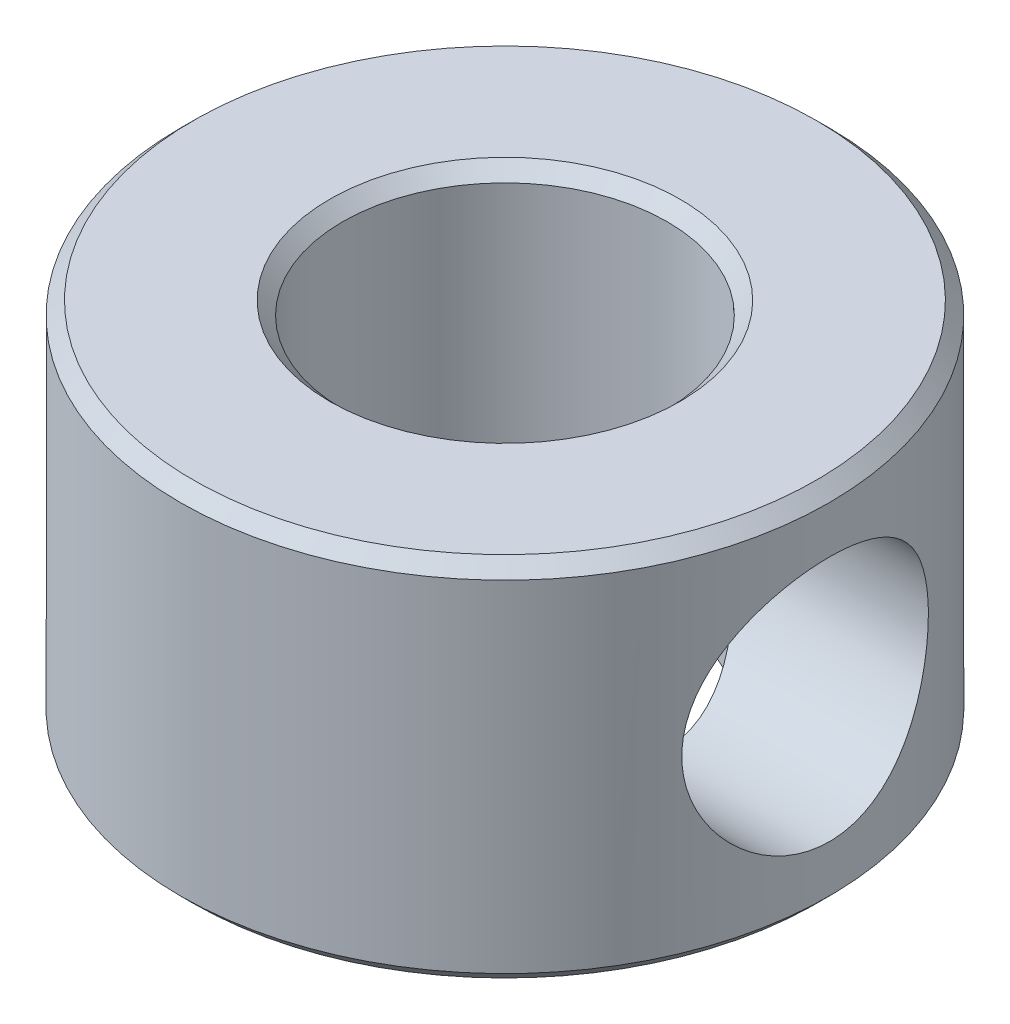
ISO-10303-21;
HEADER;
FILE_DESCRIPTION(('STEP AP214'),'2;1');
FILE_NAME('part.step','',(''),(''),'','','');
FILE_SCHEMA(('AUTOMOTIVE_DESIGN { 1 0 10303 214 1 1 1 1 }'));
ENDSEC;
DATA;
#1=APPLICATION_CONTEXT('core data for automotive mechanical design processes');
#2=APPLICATION_PROTOCOL_DEFINITION('international standard','automotive_design',2000,#1);
#3=PRODUCT_CONTEXT('',#1,'mechanical');
#4=PRODUCT('Part','Part','',(#3));
#5=PRODUCT_RELATED_PRODUCT_CATEGORY('part','',(#4));
#6=PRODUCT_DEFINITION_FORMATION('','',#4);
#7=PRODUCT_DEFINITION_CONTEXT('part definition',#1,'design');
#8=PRODUCT_DEFINITION('design','',#6,#7);
#9=PRODUCT_DEFINITION_SHAPE('','',#8);
#10=(LENGTH_UNIT() NAMED_UNIT(*) SI_UNIT(.MILLI.,.METRE.));
#11=(NAMED_UNIT(*) PLANE_ANGLE_UNIT() SI_UNIT($,.RADIAN.));
#12=(NAMED_UNIT(*) SI_UNIT($,.STERADIAN.) SOLID_ANGLE_UNIT());
#13=UNCERTAINTY_MEASURE_WITH_UNIT(LENGTH_MEASURE(1.E-05),#10,'distance_accuracy_value','');
#14=(GEOMETRIC_REPRESENTATION_CONTEXT(3) GLOBAL_UNCERTAINTY_ASSIGNED_CONTEXT((#13)) GLOBAL_UNIT_ASSIGNED_CONTEXT((#10,
#11,#12)) REPRESENTATION_CONTEXT('',''));
#15=CARTESIAN_POINT('',(0.,0.,0.));
#16=DIRECTION('',(0.,0.,1.));
#17=DIRECTION('',(1.,0.,0.));
#18=AXIS2_PLACEMENT_3D('',#15,#16,#17);
#19=CARTESIAN_POINT('',(0.,0.,0.));
#20=DIRECTION('',(0.,-1.,0.));
#21=DIRECTION('',(0.,0.,-1.));
#22=AXIS2_PLACEMENT_3D('',#19,#20,#21);
#23=CONICAL_SURFACE('',#22,3.42899999998281,0.785398163397448);
#24=CARTESIAN_POINT('',(0.,0.,0.));
#25=DIRECTION('',(0.,-1.,0.));
#26=DIRECTION('',(0.,0.,-1.));
#27=AXIS2_PLACEMENT_3D('',#24,#25,#26);
#28=CIRCLE('',#27,3.42899999998281);
#29=CARTESIAN_POINT('',(0.,0.,-3.42899999998281));
#30=VERTEX_POINT('',#29);
#31=EDGE_CURVE('E73',#30,#30,#28,.T.);
#32=ORIENTED_EDGE('',*,*,#31,.T.);
#33=EDGE_LOOP('',(#32));
#34=FACE_BOUND('',#33,.T.);
#35=CARTESIAN_POINT('',(0.,0.254,0.));
#36=DIRECTION('',(0.,1.,0.));
#37=DIRECTION('',(0.,0.,1.));
#38=AXIS2_PLACEMENT_3D('',#35,#36,#37);
#39=CIRCLE('',#38,3.175);
#40=CARTESIAN_POINT('',(0.,0.254,3.175));
#41=VERTEX_POINT('',#40);
#42=EDGE_CURVE('E36',#41,#41,#39,.T.);
#43=ORIENTED_EDGE('',*,*,#42,.T.);
#44=EDGE_LOOP('',(#43));
#45=FACE_BOUND('',#44,.T.);
#46=ADVANCED_FACE('F15',(#34,#45),#23,.F.);
#47=CARTESIAN_POINT('',(0.,7.17549999995981,0.));
#48=DIRECTION('',(0.,1.,0.));
#49=DIRECTION('',(0.,0.,1.));
#50=AXIS2_PLACEMENT_3D('',#47,#48,#49);
#51=CONICAL_SURFACE('',#50,3.42899999998281,0.785398163397448);
#52=CARTESIAN_POINT('',(0.,6.9215,0.));
#53=DIRECTION('',(0.,1.,0.));
#54=DIRECTION('',(0.,0.,1.));
#55=AXIS2_PLACEMENT_3D('',#52,#53,#54);
#56=CIRCLE('',#55,3.175);
#57=CARTESIAN_POINT('',(0.,6.9215,3.175));
#58=VERTEX_POINT('',#57);
#59=EDGE_CURVE('E65',#58,#58,#56,.F.);
#60=ORIENTED_EDGE('',*,*,#59,.T.);
#61=EDGE_LOOP('',(#60));
#62=FACE_BOUND('',#61,.T.);
#63=CARTESIAN_POINT('',(0.,7.17549999995981,0.));
#64=DIRECTION('',(0.,1.,0.));
#65=DIRECTION('',(0.,0.,1.));
#66=AXIS2_PLACEMENT_3D('',#63,#64,#65);
#67=CIRCLE('',#66,3.42899999998281);
#68=CARTESIAN_POINT('',(0.,7.17549999995981,3.42899999998281));
#69=VERTEX_POINT('',#68);
#70=EDGE_CURVE('E18',#69,#69,#67,.F.);
#71=ORIENTED_EDGE('',*,*,#70,.F.);
#72=EDGE_LOOP('',(#71));
#73=FACE_BOUND('',#72,.T.);
#74=ADVANCED_FACE('F97',(#62,#73),#51,.F.);
#75=CARTESIAN_POINT('',(0.,7.1755,0.));
#76=DIRECTION('',(0.,1.,0.));
#77=DIRECTION('',(0.,0.,1.));
#78=AXIS2_PLACEMENT_3D('',#75,#76,#77);
#79=PLANE('',#78);
#80=ORIENTED_EDGE('',*,*,#70,.T.);
#81=EDGE_LOOP('',(#80));
#82=FACE_BOUND('',#81,.T.);
#83=CARTESIAN_POINT('',(0.,7.17550000001665,0.));
#84=DIRECTION('',(0.,-1.,0.));
#85=DIRECTION('',(0.,0.,-1.));
#86=AXIS2_PLACEMENT_3D('',#83,#84,#85);
#87=CIRCLE('',#86,6.09600000001365);
#88=CARTESIAN_POINT('',(0.,7.17550000001665,-6.09600000001365));
#89=VERTEX_POINT('',#88);
#90=EDGE_CURVE('E67',#89,#89,#87,.T.);
#91=ORIENTED_EDGE('',*,*,#90,.F.);
#92=EDGE_LOOP('',(#91));
#93=FACE_BOUND('',#92,.T.);
#94=ADVANCED_FACE('F88',(#82,#93),#79,.T.);
#95=CARTESIAN_POINT('',(0.,0.,0.));
#96=DIRECTION('',(0.,1.,0.));
#97=DIRECTION('',(0.,0.,1.));
#98=AXIS2_PLACEMENT_3D('',#95,#96,#97);
#99=PLANE('',#98);
#100=ORIENTED_EDGE('',*,*,#31,.F.);
#101=EDGE_LOOP('',(#100));
#102=FACE_BOUND('',#101,.T.);
#103=CARTESIAN_POINT('',(0.,5.6843418860808E-11,0.));
#104=DIRECTION('',(0.,1.,0.));
#105=DIRECTION('',(0.,0.,1.));
#106=AXIS2_PLACEMENT_3D('',#103,#104,#105);
#107=CIRCLE('',#106,6.0959999999568);
#108=CARTESIAN_POINT('',(0.,5.6843418860808E-11,6.0959999999568));
#109=VERTEX_POINT('',#108);
#110=EDGE_CURVE('E64',#109,#109,#107,.T.);
#111=ORIENTED_EDGE('',*,*,#110,.F.);
#112=EDGE_LOOP('',(#111));
#113=FACE_BOUND('',#112,.T.);
#114=ADVANCED_FACE('F85',(#102,#113),#99,.F.);
#115=CARTESIAN_POINT('',(0.,0.,0.));
#116=DIRECTION('',(0.,1.,0.));
#117=DIRECTION('',(0.,0.,1.));
#118=AXIS2_PLACEMENT_3D('',#115,#116,#117);
#119=CYLINDRICAL_SURFACE('',#118,3.175);
#120=ORIENTED_EDGE('',*,*,#42,.F.);
#121=EDGE_LOOP('',(#120));
#122=FACE_BOUND('',#121,.T.);
#123=CARTESIAN_POINT('',(2.06350575477753,3.58775,-2.413));
#124=CARTESIAN_POINT('',(2.06350331734548,3.64373102336542,-2.41300116636526));
#125=CARTESIAN_POINT('',(2.065797453746,3.69970091216051,-2.4110462158827));
#126=CARTESIAN_POINT('',(2.07480651484921,3.81102619733832,-2.40329681190075));
#127=CARTESIAN_POINT('',(2.08152327534689,3.8663813288335,-2.39750076398684));
#128=CARTESIAN_POINT('',(2.10779575765198,4.03096671508492,-2.37452857368797));
#129=CARTESIAN_POINT('',(2.13347116105826,4.13848577646196,-2.35176933884989));
#130=CARTESIAN_POINT('',(2.20269021569742,4.36763246714568,-2.28722418083166));
#131=CARTESIAN_POINT('',(2.24883104097927,4.48757930738447,-2.24247678468505));
#132=CARTESIAN_POINT('',(2.34961279035049,4.71608776414318,-2.1366571908072));
#133=CARTESIAN_POINT('',(2.40426496806902,4.82463398406284,-2.07556330198389));
#134=CARTESIAN_POINT('',(2.51753996525444,5.03264587802023,-1.93671051886915));
#135=CARTESIAN_POINT('',(2.57622631801355,5.13183406250293,-1.85858971197057));
#136=CARTESIAN_POINT('',(2.69156511170815,5.31741036611413,-1.68723508065523));
#137=CARTESIAN_POINT('',(2.74821927046582,5.40380949876266,-1.5940144063819));
#138=CARTESIAN_POINT('',(2.85315193887402,5.55892467615017,-1.39716635485653));
#139=CARTESIAN_POINT('',(2.90168287826838,5.62823270651883,-1.2941434877332));
#140=CARTESIAN_POINT('',(2.98960931443145,5.75144375167086,-1.07549284146984));
#141=CARTESIAN_POINT('',(3.02900667042063,5.80534990216122,-0.959867634703158));
#142=CARTESIAN_POINT('',(3.07878886870738,5.87272481794675,-0.778268780759372));
#143=CARTESIAN_POINT('',(3.09388433020333,5.89300530870763,-0.71603074775631));
#144=CARTESIAN_POINT('',(3.12047967112838,5.92857862714859,-0.589411732485593));
#145=CARTESIAN_POINT('',(3.13198152553263,5.94387419464357,-0.525031948885168));
#146=CARTESIAN_POINT('',(3.15105644572041,5.96917180911156,-0.39471468955541));
#147=CARTESIAN_POINT('',(3.15863253681296,5.97917793240652,-0.328778454368978));
#148=CARTESIAN_POINT('',(3.16964685297938,5.99370635862612,-0.195988123621079));
#149=CARTESIAN_POINT('',(3.17308583147031,5.99822966003851,-0.129134197425563));
#150=CARTESIAN_POINT('',(3.17660104788137,6.00285936131939,0.0511839734686778));
#151=CARTESIAN_POINT('',(3.17271039078429,5.99775232164968,0.164927729705171));
#152=CARTESIAN_POINT('',(3.15304239444254,5.97179860624595,0.389465364093218));
#153=CARTESIAN_POINT('',(3.13726479729506,5.95095158901236,0.500259178187893));
#154=CARTESIAN_POINT('',(3.09583776822383,5.89566648140617,0.712565518725814));
#155=CARTESIAN_POINT('',(3.07051350908311,5.86167521274124,0.81426016244009));
#156=CARTESIAN_POINT('',(3.01173481606194,5.78165655320256,1.01022752362915));
#157=CARTESIAN_POINT('',(2.97827904498174,5.73562718260874,1.10449901701257));
#158=CARTESIAN_POINT('',(2.90036237107335,5.62630630707544,1.29638388211799));
#159=CARTESIAN_POINT('',(2.85503193439217,5.56153871019377,1.39279787549681));
#160=CARTESIAN_POINT('',(2.7593154286224,5.42036015415664,1.57395181675997));
#161=CARTESIAN_POINT('',(2.70892331802777,5.34393522328477,1.65867752061776));
#162=CARTESIAN_POINT('',(2.59554790264758,5.1640374459975,1.83208839918216));
#163=CARTESIAN_POINT('',(2.53209523862624,5.05822843122925,1.91804720150165));
#164=CARTESIAN_POINT('',(2.4080110589705,4.83249277772522,2.07167080696696));
#165=CARTESIAN_POINT('',(2.34737881309176,4.7125698219863,2.13934036751724));
#166=CARTESIAN_POINT('',(2.25298451550365,4.49572297827659,2.23783654656671));
#167=CARTESIAN_POINT('',(2.21653438652381,4.40224345755611,2.2736551086894));
#168=CARTESIAN_POINT('',(2.15299951018114,4.20873654797274,2.33391186939965));
#169=CARTESIAN_POINT('',(2.12588916683273,4.10872796273694,2.35838123568328));
#170=CARTESIAN_POINT('',(2.09195623579652,3.93804252759953,2.38844545558512));
#171=CARTESIAN_POINT('',(2.08138138390222,3.86873364027225,2.39761524399995));
#172=CARTESIAN_POINT('',(2.06715899430662,3.72886028316942,2.40989063003403));
#173=CARTESIAN_POINT('',(2.06350882638652,3.6582963004036,2.41299853016703));
#174=CARTESIAN_POINT('',(2.06350331734548,3.53176897663458,2.41300116636526));
#175=CARTESIAN_POINT('',(2.065797453746,3.47579908783949,2.4110462158827));
#176=CARTESIAN_POINT('',(2.07480651484921,3.36447380266168,2.40329681190075));
#177=CARTESIAN_POINT('',(2.08152327534689,3.3091186711665,2.39750076398684));
#178=CARTESIAN_POINT('',(2.10779575765197,3.14453328491508,2.37452857368797));
#179=CARTESIAN_POINT('',(2.13347116105826,3.03701422353804,2.35176933884989));
#180=CARTESIAN_POINT('',(2.20269021569742,2.80786753285432,2.28722418083166));
#181=CARTESIAN_POINT('',(2.24883104097927,2.68792069261554,2.24247678468506));
#182=CARTESIAN_POINT('',(2.34961279035049,2.45941223585682,2.1366571908072));
#183=CARTESIAN_POINT('',(2.40426496806902,2.35086601593716,2.07556330198389));
#184=CARTESIAN_POINT('',(2.51753996525444,2.14285412197977,1.93671051886915));
#185=CARTESIAN_POINT('',(2.57622631801355,2.04366593749707,1.85858971197057));
#186=CARTESIAN_POINT('',(2.69156511170815,1.85808963388587,1.68723508065523));
#187=CARTESIAN_POINT('',(2.74821927046581,1.77169050123733,1.5940144063819));
#188=CARTESIAN_POINT('',(2.85315193887402,1.61657532384983,1.39716635485653));
#189=CARTESIAN_POINT('',(2.90168287826838,1.54726729348117,1.2941434877332));
#190=CARTESIAN_POINT('',(2.98960931443145,1.42405624832914,1.07549284146984));
#191=CARTESIAN_POINT('',(3.02900667042063,1.37015009783878,0.95986763470316));
#192=CARTESIAN_POINT('',(3.07878886870738,1.30277518205325,0.778268780759374));
#193=CARTESIAN_POINT('',(3.09388433020333,1.28249469129237,0.716030747756312));
#194=CARTESIAN_POINT('',(3.12047967112838,1.24692137285141,0.589411732485594));
#195=CARTESIAN_POINT('',(3.13198152553263,1.23162580535643,0.52503194888517));
#196=CARTESIAN_POINT('',(3.15105644572041,1.20632819088844,0.394714689555412));
#197=CARTESIAN_POINT('',(3.15863253681296,1.19632206759347,0.32877845436898));
#198=CARTESIAN_POINT('',(3.16964685297938,1.18179364137388,0.195988123621081));
#199=CARTESIAN_POINT('',(3.17308583147031,1.17727033996149,0.129134197425564));
#200=CARTESIAN_POINT('',(3.17660104788137,1.17264063868061,-0.0511839734686767));
#201=CARTESIAN_POINT('',(3.17271039078429,1.17774767835032,-0.164927729705169));
#202=CARTESIAN_POINT('',(3.15304239444254,1.20370139375405,-0.389465364093217));
#203=CARTESIAN_POINT('',(3.13726479729506,1.22454841098764,-0.500259178187892));
#204=CARTESIAN_POINT('',(3.09583776822383,1.27983351859383,-0.712565518725814));
#205=CARTESIAN_POINT('',(3.07051350908311,1.31382478725876,-0.81426016244009));
#206=CARTESIAN_POINT('',(3.01173481606194,1.39384344679744,-1.01022752362915));
#207=CARTESIAN_POINT('',(2.97827904498174,1.43987281739125,-1.10449901701257));
#208=CARTESIAN_POINT('',(2.90036237107335,1.54919369292456,-1.29638388211799));
#209=CARTESIAN_POINT('',(2.85503193439217,1.61396128980622,-1.39279787549681));
#210=CARTESIAN_POINT('',(2.7593154286224,1.75513984584336,-1.57395181675996));
#211=CARTESIAN_POINT('',(2.70892331802777,1.83156477671523,-1.65867752061776));
#212=CARTESIAN_POINT('',(2.59554790264758,2.0114625540025,-1.83208839918216));
#213=CARTESIAN_POINT('',(2.53209523862624,2.11727156877075,-1.91804720150165));
#214=CARTESIAN_POINT('',(2.4080110589705,2.34300722227478,-2.07167080696696));
#215=CARTESIAN_POINT('',(2.34737881309176,2.46293017801369,-2.13934036751724));
#216=CARTESIAN_POINT('',(2.25298451550366,2.67977702172341,-2.23783654656671));
#217=CARTESIAN_POINT('',(2.21653438652381,2.77325654244388,-2.2736551086894));
#218=CARTESIAN_POINT('',(2.15299951018114,2.96676345202726,-2.33391186939965));
#219=CARTESIAN_POINT('',(2.12588916683273,3.06677203726306,-2.35838123568328));
#220=CARTESIAN_POINT('',(2.09195623579653,3.23745747240046,-2.38844545558512));
#221=CARTESIAN_POINT('',(2.08138138390222,3.30676635972774,-2.39761524399995));
#222=CARTESIAN_POINT('',(2.06715899430662,3.44663971683058,-2.40989063003403));
#223=CARTESIAN_POINT('',(2.06350882638652,3.5172036995964,-2.41299853016703));
#224=CARTESIAN_POINT('',(2.06350575477753,3.58775,-2.413));
#225=B_SPLINE_CURVE_WITH_KNOTS('',3,(#123,#124,#125,#126,#127,#128,#129,#130,#131,#132,#133,
#134,#135,#136,#137,#138,#139,#140,#141,#142,#143,#144,#145,#146,#147,#148,#149,#150,#151,#152,
#153,#154,#155,#156,#157,#158,#159,#160,#161,#162,#163,#164,#165,#166,#167,#168,#169,#170,#171,
#172,#173,#174,#175,#176,#177,#178,#179,#180,#181,#182,#183,#184,#185,#186,#187,#188,#189,#190,
#191,#192,#193,#194,#195,#196,#197,#198,#199,#200,#201,#202,#203,#204,#205,#206,#207,#208,#209,
#210,#211,#212,#213,#214,#215,#216,#217,#218,#219,#220,#221,#222,#223,#224),.UNSPECIFIED.,.T.,
.F.,(4,2,2,2,2,2,2,2,2,2,2,2,2,2,2,2,2,2,2,2,2,2,2,2,2,2,2,2,2,2,2,2,2,2,2,2,2,2,2,2,2,2,2,2,2,
2,2,2,2,2,4),(0.,0.167840899061439,0.335751511461487,0.672253052316326,1.07834593721034,
1.48498038555627,1.90128952676945,2.317238043711,2.71564864583153,3.11397807665489,
3.31524468155856,3.51640047896582,3.71740102837412,3.91836496766418,4.25822456424176,
4.59809153473323,4.92729791228549,5.25655846338996,5.62924960414818,6.00239098979998,
6.45175261568918,6.90099724071932,7.21968561176668,7.53749352673918,7.74908405883766,
7.96059420590855,8.12843510496999,8.29634571737004,8.63284725822488,9.03894014311888,
9.44557459146482,9.861883732678,10.2778322496195,10.6762428517401,11.0745722825634,
11.2758388874671,11.4769946848744,11.6779952342827,11.8789591735727,12.2188187701503,
12.5586857406418,12.887892118194,13.2171526692985,13.5898438100567,13.9629851957085,
14.4123468215977,14.8615914466279,15.1802798176752,15.4980877326477,15.7096782647462,
15.9211884118171),.UNSPECIFIED.);
#226=CARTESIAN_POINT('',(2.06350575477753,3.58775,-2.413));
#227=VERTEX_POINT('',#226);
#228=EDGE_CURVE('E38',#227,#227,#225,.T.);
#229=ORIENTED_EDGE('',*,*,#228,.T.);
#230=EDGE_LOOP('',(#229));
#231=FACE_BOUND('',#230,.T.);
#232=ORIENTED_EDGE('',*,*,#59,.F.);
#233=EDGE_LOOP('',(#232));
#234=FACE_BOUND('',#233,.T.);
#235=ADVANCED_FACE('F87',(#122,#231,#234),#119,.F.);
#236=CARTESIAN_POINT('',(0.,6.92149999991898,0.));
#237=DIRECTION('',(0.,-1.,0.));
#238=DIRECTION('',(0.,0.,-1.));
#239=AXIS2_PLACEMENT_3D('',#236,#237,#238);
#240=CONICAL_SURFACE('',#239,6.35000000011132,0.785398163397448);
#241=CARTESIAN_POINT('',(0.,6.9215,0.));
#242=DIRECTION('',(0.,1.,0.));
#243=DIRECTION('',(0.,0.,1.));
#244=AXIS2_PLACEMENT_3D('',#241,#242,#243);
#245=CIRCLE('',#244,6.35);
#246=CARTESIAN_POINT('',(0.,6.9215,6.35));
#247=VERTEX_POINT('',#246);
#248=EDGE_CURVE('E27',#247,#247,#245,.F.);
#249=ORIENTED_EDGE('',*,*,#248,.F.);
#250=EDGE_LOOP('',(#249));
#251=FACE_BOUND('',#250,.T.);
#252=ORIENTED_EDGE('',*,*,#90,.T.);
#253=EDGE_LOOP('',(#252));
#254=FACE_BOUND('',#253,.T.);
#255=ADVANCED_FACE('F95',(#251,#254),#240,.T.);
#256=CARTESIAN_POINT('',(0.,0.254000000040833,0.));
#257=DIRECTION('',(0.,1.,0.));
#258=DIRECTION('',(0.,0.,1.));
#259=AXIS2_PLACEMENT_3D('',#256,#257,#258);
#260=CONICAL_SURFACE('',#259,6.34999999994079,0.785398163397448);
#261=ORIENTED_EDGE('',*,*,#110,.T.);
#262=EDGE_LOOP('',(#261));
#263=FACE_BOUND('',#262,.T.);
#264=CARTESIAN_POINT('',(0.,0.254,0.));
#265=DIRECTION('',(0.,1.,0.));
#266=DIRECTION('',(0.,0.,1.));
#267=AXIS2_PLACEMENT_3D('',#264,#265,#266);
#268=CIRCLE('',#267,6.35);
#269=CARTESIAN_POINT('',(0.,0.254,6.35));
#270=VERTEX_POINT('',#269);
#271=EDGE_CURVE('E22',#270,#270,#268,.T.);
#272=ORIENTED_EDGE('',*,*,#271,.F.);
#273=EDGE_LOOP('',(#272));
#274=FACE_BOUND('',#273,.T.);
#275=ADVANCED_FACE('F55',(#263,#274),#260,.T.);
#276=CARTESIAN_POINT('',(0.,3.58775,0.));
#277=DIRECTION('',(1.,0.,0.));
#278=DIRECTION('',(0.,0.,-1.));
#279=AXIS2_PLACEMENT_3D('',#276,#277,#278);
#280=CYLINDRICAL_SURFACE('',#279,2.413);
#281=CARTESIAN_POINT('',(5.87366418856237,3.58775,-2.413));
#282=CARTESIAN_POINT('',(5.87367180957185,3.45777727241982,-2.41299211036134));
#283=CARTESIAN_POINT('',(5.87803446078459,3.32768224391578,-2.40244573695549));
#284=CARTESIAN_POINT('',(5.89493112529326,3.0712902804737,-2.36067101815251));
#285=CARTESIAN_POINT('',(5.90747799394448,2.94499964833227,-2.32941013422183));
#286=CARTESIAN_POINT('',(5.93910592053698,2.70019760640208,-2.24753750310633));
#287=CARTESIAN_POINT('',(5.95816658425535,2.58166327599099,-2.19698609621875));
#288=CARTESIAN_POINT('',(6.0006468163521,2.35475344210928,-2.07814922993327));
#289=CARTESIAN_POINT('',(6.02406641060781,2.2463779989539,-2.00986366525335));
#290=CARTESIAN_POINT('',(6.07397227259065,2.03726473650657,-1.85374508747788));
#291=CARTESIAN_POINT('',(6.10055057204308,1.93711780920942,-1.76514972086256));
#292=CARTESIAN_POINT('',(6.15301332433472,1.7526822366681,-1.57253987413986));
#293=CARTESIAN_POINT('',(6.17889759379266,1.66839774797521,-1.46852136532378));
#294=CARTESIAN_POINT('',(6.22814881621845,1.515225046788,-1.24352834107207));
#295=CARTESIAN_POINT('',(6.25139572601309,1.44698007817193,-1.12208727707208));
#296=CARTESIAN_POINT('',(6.29164729718719,1.33213455795031,-0.868408074733262));
#297=CARTESIAN_POINT('',(6.30865418755839,1.28552627594244,-0.736173812497092));
#298=CARTESIAN_POINT('',(6.33385765303732,1.21735309382466,-0.470860050155738));
#299=CARTESIAN_POINT('',(6.34241022734481,1.19477288008998,-0.33807591949005));
#300=CARTESIAN_POINT('',(6.35102080969203,1.17204045034324,-0.0703460721620404));
#301=CARTESIAN_POINT('',(6.35108166089634,1.17188072759247,0.0645989058796114));
#302=CARTESIAN_POINT('',(6.34292648343432,1.19340926481606,0.325530367770508));
#303=CARTESIAN_POINT('',(6.33513060699424,1.21398847186378,0.451623788433641));
#304=CARTESIAN_POINT('',(6.31269194543665,1.27454115101691,0.698413030431242));
#305=CARTESIAN_POINT('',(6.29804865551838,1.31451605300785,0.819108453098982));
#306=CARTESIAN_POINT('',(6.26309295494474,1.41322554549681,1.05378365107773));
#307=CARTESIAN_POINT('',(6.24270038417629,1.4722272259887,1.16763864820871));
#308=CARTESIAN_POINT('',(6.19830310699296,1.60707406541514,1.38411215195717));
#309=CARTESIAN_POINT('',(6.17429737293314,1.68292401921408,1.48672744742082));
#310=CARTESIAN_POINT('',(6.12344532073828,1.85461319829079,1.68432291064807));
#311=CARTESIAN_POINT('',(6.0965149808738,1.95137644331052,1.77847971681606));
#312=CARTESIAN_POINT('',(6.04397973738038,2.15950482776329,1.94957447410654));
#313=CARTESIAN_POINT('',(6.01837558691908,2.2708781404047,2.02650272147514));
#314=CARTESIAN_POINT('',(5.97084581879832,2.50843470458754,2.16259905806743));
#315=CARTESIAN_POINT('',(5.94902315130444,2.6349090842737,2.22129695396536));
#316=CARTESIAN_POINT('',(5.91274440511587,2.89687376909544,2.31615500109406));
#317=CARTESIAN_POINT('',(5.89827253384981,3.03234403269003,2.35236350653789));
#318=CARTESIAN_POINT('',(5.8836088611195,3.23892151238498,2.38867989045813));
#319=CARTESIAN_POINT('',(5.87989508578566,3.30830928066115,2.39778589744487));
#320=CARTESIAN_POINT('',(5.87492069784399,3.44770286095434,2.40994807363667));
#321=CARTESIAN_POINT('',(5.87366008165752,3.51770867206962,2.41300425166709));
#322=CARTESIAN_POINT('',(5.87367180957185,3.71772272758018,2.41299211036134));
#323=CARTESIAN_POINT('',(5.87803446078459,3.84781775608422,2.40244573695549));
#324=CARTESIAN_POINT('',(5.89493112529326,4.1042097195263,2.36067101815251));
#325=CARTESIAN_POINT('',(5.90747799394448,4.23050035166773,2.32941013422183));
#326=CARTESIAN_POINT('',(5.93910592053698,4.47530239359792,2.24753750310633));
#327=CARTESIAN_POINT('',(5.95816658425535,4.59383672400901,2.19698609621875));
#328=CARTESIAN_POINT('',(6.0006468163521,4.82074655789072,2.07814922993327));
#329=CARTESIAN_POINT('',(6.02406641060781,4.9291220010461,2.00986366525335));
#330=CARTESIAN_POINT('',(6.07397227259065,5.13823526349343,1.85374508747788));
#331=CARTESIAN_POINT('',(6.10055057204308,5.23838219079058,1.76514972086256));
#332=CARTESIAN_POINT('',(6.15301332433472,5.4228177633319,1.57253987413986));
#333=CARTESIAN_POINT('',(6.17889759379266,5.50710225202479,1.46852136532378));
#334=CARTESIAN_POINT('',(6.22814881621845,5.660274953212,1.24352834107207));
#335=CARTESIAN_POINT('',(6.25139572601309,5.72851992182807,1.12208727707208));
#336=CARTESIAN_POINT('',(6.29164729718719,5.84336544204969,0.868408074733262));
#337=CARTESIAN_POINT('',(6.30865418755839,5.88997372405756,0.736173812497091));
#338=CARTESIAN_POINT('',(6.33385765303732,5.95814690617534,0.470860050155738));
#339=CARTESIAN_POINT('',(6.34241022734481,5.98072711991002,0.33807591949005));
#340=CARTESIAN_POINT('',(6.35102080969203,6.00345954965675,0.0703460721620408));
#341=CARTESIAN_POINT('',(6.35108166089634,6.00361927240753,-0.0645989058796113));
#342=CARTESIAN_POINT('',(6.34292648343432,5.98209073518394,-0.325530367770508));
#343=CARTESIAN_POINT('',(6.33513060699424,5.96151152813622,-0.451623788433642));
#344=CARTESIAN_POINT('',(6.31269194543665,5.90095884898309,-0.698413030431243));
#345=CARTESIAN_POINT('',(6.29804865551838,5.86098394699215,-0.819108453098982));
#346=CARTESIAN_POINT('',(6.26309295494474,5.76227445450319,-1.05378365107773));
#347=CARTESIAN_POINT('',(6.24270038417628,5.7032727740113,-1.16763864820872));
#348=CARTESIAN_POINT('',(6.19830310699295,5.56842593458486,-1.38411215195717));
#349=CARTESIAN_POINT('',(6.17429737293314,5.49257598078591,-1.48672744742082));
#350=CARTESIAN_POINT('',(6.12344532073828,5.32088680170921,-1.68432291064808));
#351=CARTESIAN_POINT('',(6.0965149808738,5.22412355668948,-1.77847971681606));
#352=CARTESIAN_POINT('',(6.04397973738038,5.01599517223671,-1.94957447410654));
#353=CARTESIAN_POINT('',(6.01837558691908,4.9046218595953,-2.02650272147514));
#354=CARTESIAN_POINT('',(5.97084581879832,4.66706529541245,-2.16259905806743));
#355=CARTESIAN_POINT('',(5.94902315130444,4.5405909157263,-2.22129695396536));
#356=CARTESIAN_POINT('',(5.91274440511587,4.27862623090456,-2.31615500109406));
#357=CARTESIAN_POINT('',(5.89827253384981,4.14315596730997,-2.35236350653789));
#358=CARTESIAN_POINT('',(5.8836088611195,3.93657848761502,-2.38867989045813));
#359=CARTESIAN_POINT('',(5.87989508578566,3.86719071933885,-2.39778589744487));
#360=CARTESIAN_POINT('',(5.87492069784399,3.72779713904566,-2.40994807363667));
#361=CARTESIAN_POINT('',(5.87366008165752,3.65779132793038,-2.41300425166709));
#362=CARTESIAN_POINT('',(5.87366418856237,3.58775,-2.413));
#363=B_SPLINE_CURVE_WITH_KNOTS('',3,(#281,#282,#283,#284,#285,#286,#287,#288,#289,#290,#291,
#292,#293,#294,#295,#296,#297,#298,#299,#300,#301,#302,#303,#304,#305,#306,#307,#308,#309,#310,
#311,#312,#313,#314,#315,#316,#317,#318,#319,#320,#321,#322,#323,#324,#325,#326,#327,#328,#329,
#330,#331,#332,#333,#334,#335,#336,#337,#338,#339,#340,#341,#342,#343,#344,#345,#346,#347,#348,
#349,#350,#351,#352,#353,#354,#355,#356,#357,#358,#359,#360,#361,#362),.UNSPECIFIED.,.T.,.F.,(4,
2,2,2,2,2,2,2,2,2,2,2,2,2,2,2,2,2,2,2,2,2,2,2,2,2,2,2,2,2,2,2,2,2,2,2,2,2,2,2,4),(0.,
0.389643580362967,0.77990067178345,1.16894692384388,1.5579954856,1.96516570266148,
2.37244246542359,2.7939954389542,3.21539768298665,3.61818498516752,4.02083742740026,
4.40304273180081,4.78527621734663,5.17312768194217,5.56108966725667,5.97224836015414,
6.3836380534784,6.80489417359002,7.22524139097077,7.43521769991025,7.64519370254,
8.03483728290297,8.42509437432345,8.81414062638388,9.20318918814,9.61035940520148,
10.0176361679636,10.4391891414942,10.8605913855266,11.2633786877075,11.6660311299403,
12.0482364343408,12.4304699198866,12.8183213844822,13.2062833697967,13.6174420626941,
14.0288317560184,14.45008787613,14.8704350935108,15.0804114024502,15.29038740508),.UNSPECIFIED.);
#364=CARTESIAN_POINT('',(5.87366418856237,3.58775,-2.413));
#365=VERTEX_POINT('',#364);
#366=EDGE_CURVE('E10',#365,#365,#363,.T.);
#367=ORIENTED_EDGE('',*,*,#366,.F.);
#368=EDGE_LOOP('',(#367));
#369=FACE_BOUND('',#368,.T.);
#370=ORIENTED_EDGE('',*,*,#228,.F.);
#371=EDGE_LOOP('',(#370));
#372=FACE_BOUND('',#371,.T.);
#373=ADVANCED_FACE('F44',(#369,#372),#280,.F.);
#374=CARTESIAN_POINT('',(0.,0.,0.));
#375=DIRECTION('',(0.,1.,0.));
#376=DIRECTION('',(0.,0.,1.));
#377=AXIS2_PLACEMENT_3D('',#374,#375,#376);
#378=CYLINDRICAL_SURFACE('',#377,6.35);
#379=ORIENTED_EDGE('',*,*,#271,.T.);
#380=EDGE_LOOP('',(#379));
#381=FACE_BOUND('',#380,.T.);
#382=ORIENTED_EDGE('',*,*,#366,.T.);
#383=EDGE_LOOP('',(#382));
#384=FACE_BOUND('',#383,.T.);
#385=ORIENTED_EDGE('',*,*,#248,.T.);
#386=EDGE_LOOP('',(#385));
#387=FACE_BOUND('',#386,.T.);
#388=ADVANCED_FACE('F47',(#381,#384,#387),#378,.T.);
#389=CLOSED_SHELL('',(#46,#74,#94,#114,#235,#255,#275,#373,#388));
#390=MANIFOLD_SOLID_BREP('B1',#389);
#391=ADVANCED_BREP_SHAPE_REPRESENTATION('',(#18,#390),#14);
#392=SHAPE_DEFINITION_REPRESENTATION(#9,#391);
ENDSEC;
END-ISO-10303-21;
